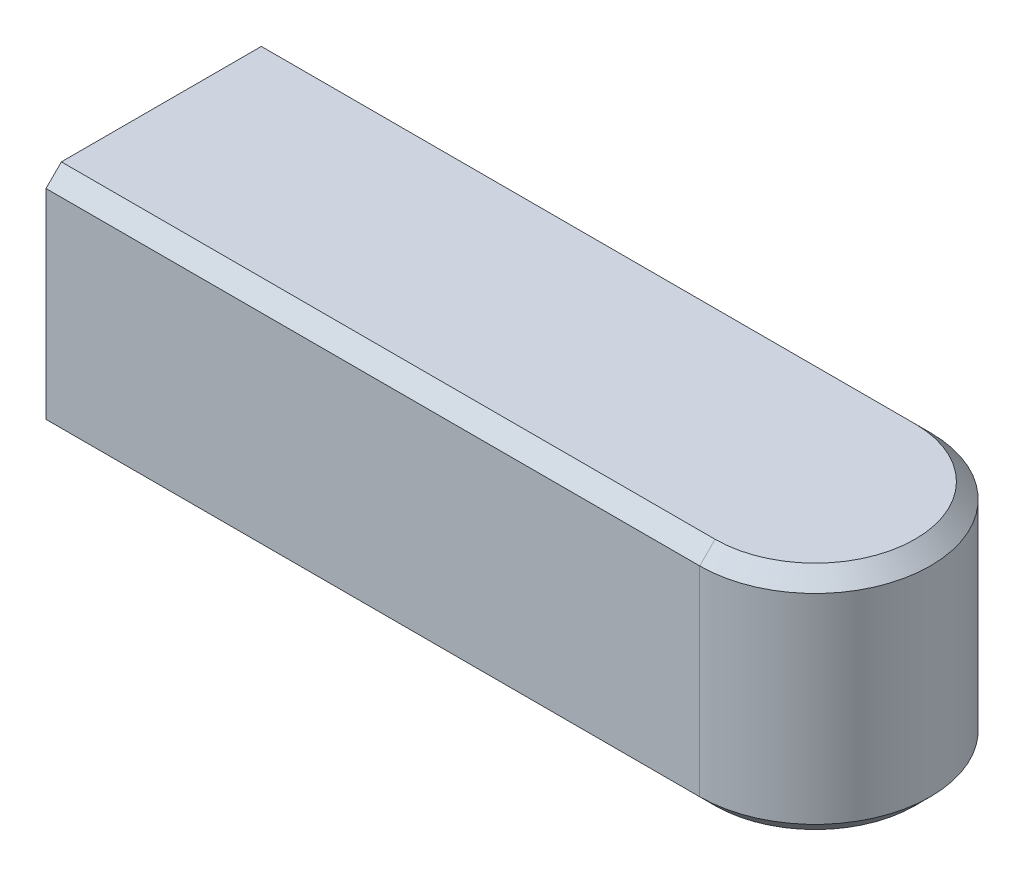
ISO-10303-21;
HEADER;
FILE_DESCRIPTION(('STEP AP214'),'2;1');
FILE_NAME('part.step','',(''),(''),'','','');
FILE_SCHEMA(('AUTOMOTIVE_DESIGN { 1 0 10303 214 1 1 1 1 }'));
ENDSEC;
DATA;
#1=APPLICATION_CONTEXT('core data for automotive mechanical design processes');
#2=APPLICATION_PROTOCOL_DEFINITION('international standard','automotive_design',2000,#1);
#3=PRODUCT_CONTEXT('',#1,'mechanical');
#4=PRODUCT('Part','Part','',(#3));
#5=PRODUCT_RELATED_PRODUCT_CATEGORY('part','',(#4));
#6=PRODUCT_DEFINITION_FORMATION('','',#4);
#7=PRODUCT_DEFINITION_CONTEXT('part definition',#1,'design');
#8=PRODUCT_DEFINITION('design','',#6,#7);
#9=PRODUCT_DEFINITION_SHAPE('','',#8);
#10=(LENGTH_UNIT() NAMED_UNIT(*) SI_UNIT(.MILLI.,.METRE.));
#11=(NAMED_UNIT(*) PLANE_ANGLE_UNIT() SI_UNIT($,.RADIAN.));
#12=(NAMED_UNIT(*) SI_UNIT($,.STERADIAN.) SOLID_ANGLE_UNIT());
#13=UNCERTAINTY_MEASURE_WITH_UNIT(LENGTH_MEASURE(1.E-05),#10,'distance_accuracy_value','');
#14=(GEOMETRIC_REPRESENTATION_CONTEXT(3) GLOBAL_UNCERTAINTY_ASSIGNED_CONTEXT((#13)) GLOBAL_UNIT_ASSIGNED_CONTEXT((#10,
#11,#12)) REPRESENTATION_CONTEXT('',''));
#15=CARTESIAN_POINT('',(0.,0.,0.));
#16=DIRECTION('',(0.,0.,1.));
#17=DIRECTION('',(1.,0.,0.));
#18=AXIS2_PLACEMENT_3D('',#15,#16,#17);
#19=CARTESIAN_POINT('',(3.5,0.,0.));
#20=DIRECTION('',(0.,-1.,0.));
#21=DIRECTION('',(0.,0.,-1.));
#22=AXIS2_PLACEMENT_3D('',#19,#20,#21);
#23=CYLINDRICAL_SURFACE('',#22,1.5);
#24=DIRECTION('',(0.,-1.,0.));
#25=VECTOR('',#24,1.);
#26=CARTESIAN_POINT('',(3.5,3.,1.5));
#27=LINE('',#26,#25);
#28=CARTESIAN_POINT('',(3.5,0.199999999999998,1.5));
#29=VERTEX_POINT('',#28);
#30=CARTESIAN_POINT('',(3.5,2.8,1.5));
#31=VERTEX_POINT('',#30);
#32=EDGE_CURVE('E121',#29,#31,#27,.F.);
#33=ORIENTED_EDGE('',*,*,#32,.F.);
#34=CARTESIAN_POINT('',(3.5,0.199999999999998,0.));
#35=DIRECTION('',(0.,1.,0.));
#36=DIRECTION('',(0.,0.,1.));
#37=AXIS2_PLACEMENT_3D('',#34,#35,#36);
#38=CIRCLE('',#37,1.5);
#39=CARTESIAN_POINT('',(3.5,0.199999999999998,-1.5));
#40=VERTEX_POINT('',#39);
#41=EDGE_CURVE('E120',#29,#40,#38,.T.);
#42=ORIENTED_EDGE('',*,*,#41,.T.);
#43=DIRECTION('',(0.,-1.,0.));
#44=VECTOR('',#43,1.);
#45=CARTESIAN_POINT('',(3.5,3.,-1.5));
#46=LINE('',#45,#44);
#47=CARTESIAN_POINT('',(3.5,2.8,-1.5));
#48=VERTEX_POINT('',#47);
#49=EDGE_CURVE('E106',#48,#40,#46,.T.);
#50=ORIENTED_EDGE('',*,*,#49,.F.);
#51=CARTESIAN_POINT('',(3.5,2.8,0.));
#52=DIRECTION('',(0.,1.,0.));
#53=DIRECTION('',(0.,0.,1.));
#54=AXIS2_PLACEMENT_3D('',#51,#52,#53);
#55=CIRCLE('',#54,1.5);
#56=EDGE_CURVE('E117',#48,#31,#55,.F.);
#57=ORIENTED_EDGE('',*,*,#56,.T.);
#58=EDGE_LOOP('',(#33,#42,#50,#57));
#59=FACE_BOUND('',#58,.T.);
#60=ADVANCED_FACE('F35',(#59),#23,.T.);
#61=CARTESIAN_POINT('',(-5.,3.,-1.5));
#62=DIRECTION('',(1.,0.,0.));
#63=DIRECTION('',(0.,0.,-1.));
#64=AXIS2_PLACEMENT_3D('',#61,#62,#63);
#65=PLANE('',#64);
#66=DIRECTION('',(0.,-1.,0.));
#67=VECTOR('',#66,1.);
#68=CARTESIAN_POINT('',(-5.,3.,-1.5));
#69=LINE('',#68,#67);
#70=CARTESIAN_POINT('',(-5.,2.8,-1.5));
#71=VERTEX_POINT('',#70);
#72=CARTESIAN_POINT('',(-5.,0.199999999999998,-1.5));
#73=VERTEX_POINT('',#72);
#74=EDGE_CURVE('E109',#71,#73,#69,.T.);
#75=ORIENTED_EDGE('',*,*,#74,.T.);
#76=DIRECTION('',(0.,0.707106781186545,-0.707106781186551));
#77=VECTOR('',#76,1.);
#78=CARTESIAN_POINT('',(-5.,0.199999999999998,-1.5));
#79=LINE('',#78,#77);
#80=CARTESIAN_POINT('',(-5.,0.,-1.3));
#81=VERTEX_POINT('',#80);
#82=EDGE_CURVE('E151',#73,#81,#79,.F.);
#83=ORIENTED_EDGE('',*,*,#82,.T.);
#84=DIRECTION('',(0.,0.,1.));
#85=VECTOR('',#84,1.);
#86=CARTESIAN_POINT('',(-5.,0.,-1.5));
#87=LINE('',#86,#85);
#88=CARTESIAN_POINT('',(-5.,0.,1.3));
#89=VERTEX_POINT('',#88);
#90=EDGE_CURVE('E136',#81,#89,#87,.T.);
#91=ORIENTED_EDGE('',*,*,#90,.T.);
#92=DIRECTION('',(0.,-0.707106781186545,-0.707106781186551));
#93=VECTOR('',#92,1.);
#94=CARTESIAN_POINT('',(-5.,0.199999999999998,1.5));
#95=LINE('',#94,#93);
#96=CARTESIAN_POINT('',(-5.,0.199999999999998,1.5));
#97=VERTEX_POINT('',#96);
#98=EDGE_CURVE('E153',#89,#97,#95,.F.);
#99=ORIENTED_EDGE('',*,*,#98,.T.);
#100=DIRECTION('',(0.,-1.,0.));
#101=VECTOR('',#100,1.);
#102=CARTESIAN_POINT('',(-5.,3.,1.5));
#103=LINE('',#102,#101);
#104=CARTESIAN_POINT('',(-5.,2.8,1.5));
#105=VERTEX_POINT('',#104);
#106=EDGE_CURVE('E161',#105,#97,#103,.T.);
#107=ORIENTED_EDGE('',*,*,#106,.F.);
#108=DIRECTION('',(0.,0.707106781186548,-0.707106781186548));
#109=VECTOR('',#108,1.);
#110=CARTESIAN_POINT('',(-5.,3.,1.3));
#111=LINE('',#110,#109);
#112=CARTESIAN_POINT('',(-5.,3.,1.3));
#113=VERTEX_POINT('',#112);
#114=EDGE_CURVE('E157',#105,#113,#111,.T.);
#115=ORIENTED_EDGE('',*,*,#114,.T.);
#116=DIRECTION('',(0.,0.,1.));
#117=VECTOR('',#116,1.);
#118=CARTESIAN_POINT('',(-5.,3.,-1.5));
#119=LINE('',#118,#117);
#120=CARTESIAN_POINT('',(-5.,3.,-1.3));
#121=VERTEX_POINT('',#120);
#122=EDGE_CURVE('E165',#121,#113,#119,.T.);
#123=ORIENTED_EDGE('',*,*,#122,.F.);
#124=DIRECTION('',(0.,-0.707106781186548,-0.707106781186548));
#125=VECTOR('',#124,1.);
#126=CARTESIAN_POINT('',(-5.,3.,-1.3));
#127=LINE('',#126,#125);
#128=EDGE_CURVE('E155',#121,#71,#127,.T.);
#129=ORIENTED_EDGE('',*,*,#128,.T.);
#130=EDGE_LOOP('',(#75,#83,#91,#99,#107,#115,#123,#129));
#131=FACE_BOUND('',#130,.T.);
#132=ADVANCED_FACE('F178',(#131),#65,.F.);
#133=CARTESIAN_POINT('',(-5.,3.,1.5));
#134=DIRECTION('',(0.,0.,-1.));
#135=DIRECTION('',(-1.,0.,0.));
#136=AXIS2_PLACEMENT_3D('',#133,#134,#135);
#137=PLANE('',#136);
#138=ORIENTED_EDGE('',*,*,#106,.T.);
#139=DIRECTION('',(1.,0.,0.));
#140=VECTOR('',#139,1.);
#141=CARTESIAN_POINT('',(-5.,0.199999999999998,1.5));
#142=LINE('',#141,#140);
#143=EDGE_CURVE('E141',#97,#29,#142,.T.);
#144=ORIENTED_EDGE('',*,*,#143,.T.);
#145=ORIENTED_EDGE('',*,*,#32,.T.);
#146=DIRECTION('',(-1.,0.,0.));
#147=VECTOR('',#146,1.);
#148=CARTESIAN_POINT('',(-5.,2.8,1.5));
#149=LINE('',#148,#147);
#150=EDGE_CURVE('E143',#31,#105,#149,.T.);
#151=ORIENTED_EDGE('',*,*,#150,.T.);
#152=EDGE_LOOP('',(#138,#144,#145,#151));
#153=FACE_BOUND('',#152,.T.);
#154=ADVANCED_FACE('F176',(#153),#137,.F.);
#155=CARTESIAN_POINT('',(-5.,3.,-1.5));
#156=DIRECTION('',(0.,0.,1.));
#157=DIRECTION('',(1.,0.,0.));
#158=AXIS2_PLACEMENT_3D('',#155,#156,#157);
#159=PLANE('',#158);
#160=ORIENTED_EDGE('',*,*,#49,.T.);
#161=DIRECTION('',(-1.,0.,0.));
#162=VECTOR('',#161,1.);
#163=CARTESIAN_POINT('',(-5.,0.199999999999998,-1.5));
#164=LINE('',#163,#162);
#165=EDGE_CURVE('E112',#40,#73,#164,.T.);
#166=ORIENTED_EDGE('',*,*,#165,.T.);
#167=ORIENTED_EDGE('',*,*,#74,.F.);
#168=DIRECTION('',(1.,0.,0.));
#169=VECTOR('',#168,1.);
#170=CARTESIAN_POINT('',(3.5,2.8,-1.5));
#171=LINE('',#170,#169);
#172=EDGE_CURVE('E102',#71,#48,#171,.T.);
#173=ORIENTED_EDGE('',*,*,#172,.T.);
#174=EDGE_LOOP('',(#160,#166,#167,#173));
#175=FACE_BOUND('',#174,.T.);
#176=ADVANCED_FACE('F104',(#175),#159,.F.);
#177=CARTESIAN_POINT('',(0.,3.,0.));
#178=DIRECTION('',(0.,1.,0.));
#179=DIRECTION('',(0.,0.,1.));
#180=AXIS2_PLACEMENT_3D('',#177,#178,#179);
#181=PLANE('',#180);
#182=CARTESIAN_POINT('',(3.5,3.,0.));
#183=DIRECTION('',(0.,1.,0.));
#184=DIRECTION('',(0.,0.,1.));
#185=AXIS2_PLACEMENT_3D('',#182,#183,#184);
#186=CIRCLE('',#185,1.3);
#187=CARTESIAN_POINT('',(3.5,3.,1.3));
#188=VERTEX_POINT('',#187);
#189=CARTESIAN_POINT('',(3.5,3.,-1.3));
#190=VERTEX_POINT('',#189);
#191=EDGE_CURVE('E44',#188,#190,#186,.T.);
#192=ORIENTED_EDGE('',*,*,#191,.T.);
#193=DIRECTION('',(-1.,0.,0.));
#194=VECTOR('',#193,1.);
#195=CARTESIAN_POINT('',(-5.,3.,-1.3));
#196=LINE('',#195,#194);
#197=EDGE_CURVE('E11',#190,#121,#196,.T.);
#198=ORIENTED_EDGE('',*,*,#197,.T.);
#199=ORIENTED_EDGE('',*,*,#122,.T.);
#200=DIRECTION('',(1.,0.,0.));
#201=VECTOR('',#200,1.);
#202=CARTESIAN_POINT('',(3.5,3.,1.3));
#203=LINE('',#202,#201);
#204=EDGE_CURVE('E55',#113,#188,#203,.T.);
#205=ORIENTED_EDGE('',*,*,#204,.T.);
#206=EDGE_LOOP('',(#192,#198,#199,#205));
#207=FACE_BOUND('',#206,.T.);
#208=ADVANCED_FACE('F169',(#207),#181,.T.);
#209=CARTESIAN_POINT('',(0.,0.,0.));
#210=DIRECTION('',(0.,1.,0.));
#211=DIRECTION('',(0.,0.,1.));
#212=AXIS2_PLACEMENT_3D('',#209,#210,#211);
#213=PLANE('',#212);
#214=ORIENTED_EDGE('',*,*,#90,.F.);
#215=DIRECTION('',(1.,0.,0.));
#216=VECTOR('',#215,1.);
#217=CARTESIAN_POINT('',(0.,0.,-1.3));
#218=LINE('',#217,#216);
#219=CARTESIAN_POINT('',(3.5,0.,-1.3));
#220=VERTEX_POINT('',#219);
#221=EDGE_CURVE('E128',#81,#220,#218,.T.);
#222=ORIENTED_EDGE('',*,*,#221,.T.);
#223=CARTESIAN_POINT('',(3.5,0.,0.));
#224=DIRECTION('',(0.,1.,0.));
#225=DIRECTION('',(0.,0.,1.));
#226=AXIS2_PLACEMENT_3D('',#223,#224,#225);
#227=CIRCLE('',#226,1.3);
#228=CARTESIAN_POINT('',(3.5,0.,1.3));
#229=VERTEX_POINT('',#228);
#230=EDGE_CURVE('E147',#220,#229,#227,.F.);
#231=ORIENTED_EDGE('',*,*,#230,.T.);
#232=DIRECTION('',(-1.,0.,0.));
#233=VECTOR('',#232,1.);
#234=CARTESIAN_POINT('',(0.,0.,1.3));
#235=LINE('',#234,#233);
#236=EDGE_CURVE('E149',#229,#89,#235,.T.);
#237=ORIENTED_EDGE('',*,*,#236,.T.);
#238=EDGE_LOOP('',(#214,#222,#231,#237));
#239=FACE_BOUND('',#238,.T.);
#240=ADVANCED_FACE('F193',(#239),#213,.F.);
#241=CARTESIAN_POINT('',(-5.,0.199999999999998,1.5));
#242=DIRECTION('',(0.,0.707106781186551,-0.707106781186545));
#243=DIRECTION('',(1.,0.,0.));
#244=AXIS2_PLACEMENT_3D('',#241,#242,#243);
#245=PLANE('',#244);
#246=ORIENTED_EDGE('',*,*,#98,.F.);
#247=ORIENTED_EDGE('',*,*,#236,.F.);
#248=DIRECTION('',(0.,-0.707106781186544,-0.70710678118655));
#249=VECTOR('',#248,1.);
#250=CARTESIAN_POINT('',(3.5,0.199999999999998,1.5));
#251=LINE('',#250,#249);
#252=EDGE_CURVE('E133',#29,#229,#251,.T.);
#253=ORIENTED_EDGE('',*,*,#252,.F.);
#254=ORIENTED_EDGE('',*,*,#143,.F.);
#255=EDGE_LOOP('',(#246,#247,#253,#254));
#256=FACE_BOUND('',#255,.T.);
#257=ADVANCED_FACE('F183',(#256),#245,.F.);
#258=CARTESIAN_POINT('',(3.5,0.,0.));
#259=DIRECTION('',(0.,1.,0.));
#260=DIRECTION('',(0.,0.,1.));
#261=AXIS2_PLACEMENT_3D('',#258,#259,#260);
#262=CONICAL_SURFACE('',#261,1.3,0.785398163397453);
#263=ORIENTED_EDGE('',*,*,#252,.T.);
#264=ORIENTED_EDGE('',*,*,#230,.F.);
#265=DIRECTION('',(0.,-0.707106781186544,0.707106781186551));
#266=VECTOR('',#265,1.);
#267=CARTESIAN_POINT('',(3.5,0.199999999999998,-1.5));
#268=LINE('',#267,#266);
#269=EDGE_CURVE('E131',#40,#220,#268,.T.);
#270=ORIENTED_EDGE('',*,*,#269,.F.);
#271=ORIENTED_EDGE('',*,*,#41,.F.);
#272=EDGE_LOOP('',(#263,#264,#270,#271));
#273=FACE_BOUND('',#272,.T.);
#274=ADVANCED_FACE('F187',(#273),#262,.T.);
#275=CARTESIAN_POINT('',(-5.,0.199999999999998,-1.5));
#276=DIRECTION('',(0.,0.707106781186551,0.707106781186545));
#277=DIRECTION('',(-1.,0.,0.));
#278=AXIS2_PLACEMENT_3D('',#275,#276,#277);
#279=PLANE('',#278);
#280=ORIENTED_EDGE('',*,*,#269,.T.);
#281=ORIENTED_EDGE('',*,*,#221,.F.);
#282=ORIENTED_EDGE('',*,*,#82,.F.);
#283=ORIENTED_EDGE('',*,*,#165,.F.);
#284=EDGE_LOOP('',(#280,#281,#282,#283));
#285=FACE_BOUND('',#284,.T.);
#286=ADVANCED_FACE('F191',(#285),#279,.F.);
#287=CARTESIAN_POINT('',(0.,3.,1.3));
#288=DIRECTION('',(0.,0.707106781186548,0.707106781186548));
#289=DIRECTION('',(-1.,0.,0.));
#290=AXIS2_PLACEMENT_3D('',#287,#288,#289);
#291=PLANE('',#290);
#292=ORIENTED_EDGE('',*,*,#114,.F.);
#293=ORIENTED_EDGE('',*,*,#150,.F.);
#294=DIRECTION('',(0.,-0.707106781186548,0.707106781186548));
#295=VECTOR('',#294,1.);
#296=CARTESIAN_POINT('',(3.5,3.,1.3));
#297=LINE('',#296,#295);
#298=EDGE_CURVE('E39',#188,#31,#297,.T.);
#299=ORIENTED_EDGE('',*,*,#298,.F.);
#300=ORIENTED_EDGE('',*,*,#204,.F.);
#301=EDGE_LOOP('',(#292,#293,#299,#300));
#302=FACE_BOUND('',#301,.T.);
#303=ADVANCED_FACE('F37',(#302),#291,.T.);
#304=CARTESIAN_POINT('',(3.5,3.,0.));
#305=DIRECTION('',(0.,-1.,0.));
#306=DIRECTION('',(0.,0.,-1.));
#307=AXIS2_PLACEMENT_3D('',#304,#305,#306);
#308=CONICAL_SURFACE('',#307,1.3,0.785398163397448);
#309=ORIENTED_EDGE('',*,*,#298,.T.);
#310=ORIENTED_EDGE('',*,*,#56,.F.);
#311=DIRECTION('',(0.,-0.707106781186548,-0.707106781186548));
#312=VECTOR('',#311,1.);
#313=CARTESIAN_POINT('',(3.5,3.,-1.3));
#314=LINE('',#313,#312);
#315=EDGE_CURVE('E126',#190,#48,#314,.T.);
#316=ORIENTED_EDGE('',*,*,#315,.F.);
#317=ORIENTED_EDGE('',*,*,#191,.F.);
#318=EDGE_LOOP('',(#309,#310,#316,#317));
#319=FACE_BOUND('',#318,.T.);
#320=ADVANCED_FACE('F125',(#319),#308,.T.);
#321=CARTESIAN_POINT('',(0.,3.,-1.3));
#322=DIRECTION('',(0.,0.707106781186548,-0.707106781186548));
#323=DIRECTION('',(1.,0.,0.));
#324=AXIS2_PLACEMENT_3D('',#321,#322,#323);
#325=PLANE('',#324);
#326=ORIENTED_EDGE('',*,*,#315,.T.);
#327=ORIENTED_EDGE('',*,*,#172,.F.);
#328=ORIENTED_EDGE('',*,*,#128,.F.);
#329=ORIENTED_EDGE('',*,*,#197,.F.);
#330=EDGE_LOOP('',(#326,#327,#328,#329));
#331=FACE_BOUND('',#330,.T.);
#332=ADVANCED_FACE('F130',(#331),#325,.T.);
#333=CLOSED_SHELL('',(#60,#132,#154,#176,#208,#240,#257,#274,#286,#303,#320,#332));
#334=MANIFOLD_SOLID_BREP('B2',#333);
#335=ADVANCED_BREP_SHAPE_REPRESENTATION('',(#18,#334),#14);
#336=SHAPE_DEFINITION_REPRESENTATION(#9,#335);
ENDSEC;
END-ISO-10303-21;
